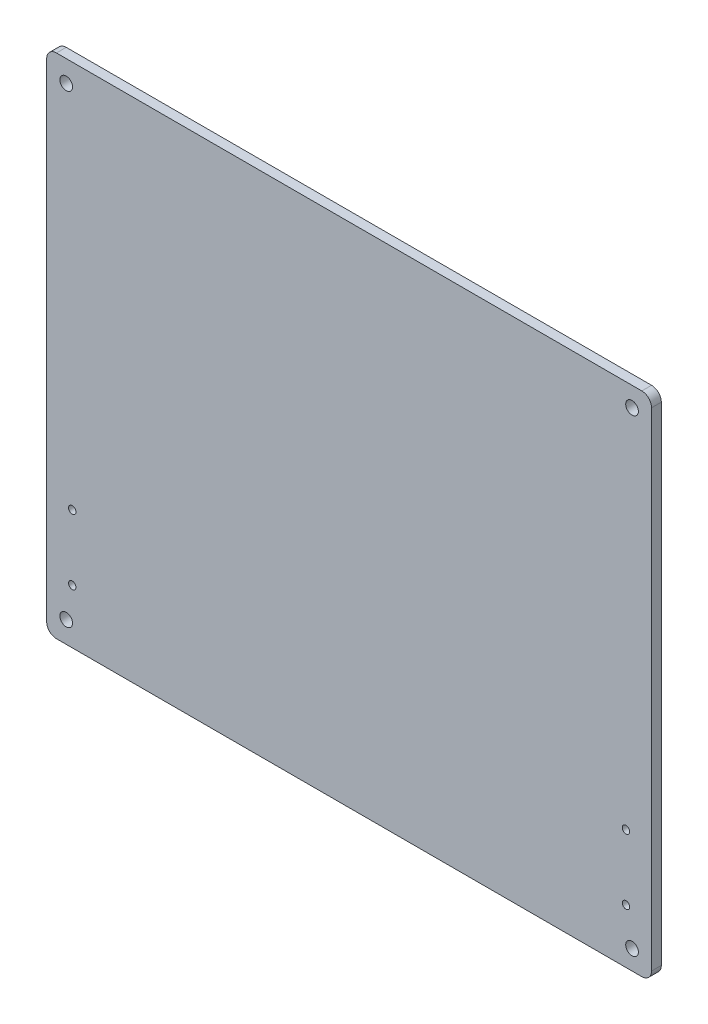
ISO-10303-21;
HEADER;
FILE_DESCRIPTION(('STEP AP214'),'2;1');
FILE_NAME('part.step','',(''),(''),'','','');
FILE_SCHEMA(('AUTOMOTIVE_DESIGN { 1 0 10303 214 1 1 1 1 }'));
ENDSEC;
DATA;
#1=APPLICATION_CONTEXT('core data for automotive mechanical design processes');
#2=APPLICATION_PROTOCOL_DEFINITION('international standard','automotive_design',2000,#1);
#3=PRODUCT_CONTEXT('',#1,'mechanical');
#4=PRODUCT('Part','Part','',(#3));
#5=PRODUCT_RELATED_PRODUCT_CATEGORY('part','',(#4));
#6=PRODUCT_DEFINITION_FORMATION('','',#4);
#7=PRODUCT_DEFINITION_CONTEXT('part definition',#1,'design');
#8=PRODUCT_DEFINITION('design','',#6,#7);
#9=PRODUCT_DEFINITION_SHAPE('','',#8);
#10=(LENGTH_UNIT() NAMED_UNIT(*) SI_UNIT(.MILLI.,.METRE.));
#11=(NAMED_UNIT(*) PLANE_ANGLE_UNIT() SI_UNIT($,.RADIAN.));
#12=(NAMED_UNIT(*) SI_UNIT($,.STERADIAN.) SOLID_ANGLE_UNIT());
#13=UNCERTAINTY_MEASURE_WITH_UNIT(LENGTH_MEASURE(1.E-05),#10,'distance_accuracy_value','');
#14=(GEOMETRIC_REPRESENTATION_CONTEXT(3) GLOBAL_UNCERTAINTY_ASSIGNED_CONTEXT((#13)) GLOBAL_UNIT_ASSIGNED_CONTEXT((#10,
#11,#12)) REPRESENTATION_CONTEXT('',''));
#15=CARTESIAN_POINT('',(0.,0.,0.));
#16=DIRECTION('',(0.,0.,1.));
#17=DIRECTION('',(1.,0.,0.));
#18=AXIS2_PLACEMENT_3D('',#15,#16,#17);
#19=CARTESIAN_POINT('',(-295.,-5.00000000000001,5.));
#20=DIRECTION('',(0.,0.,-1.));
#21=DIRECTION('',(-1.,0.,0.));
#22=AXIS2_PLACEMENT_3D('',#19,#20,#21);
#23=PLANE('',#22);
#24=CARTESIAN_POINT('',(-295.,-5.00000000000001,5.));
#25=DIRECTION('',(0.,0.,1.));
#26=DIRECTION('',(-1.,0.,0.));
#27=AXIS2_PLACEMENT_3D('',#24,#25,#26);
#28=CIRCLE('',#27,5.);
#29=CARTESIAN_POINT('',(-300.,-4.99999999999997,5.));
#30=VERTEX_POINT('',#29);
#31=CARTESIAN_POINT('',(-295.,-10.,5.));
#32=VERTEX_POINT('',#31);
#33=EDGE_CURVE('E149',#30,#32,#28,.T.);
#34=ORIENTED_EDGE('',*,*,#33,.T.);
#35=DIRECTION('',(1.,0.,0.));
#36=VECTOR('',#35,1.);
#37=CARTESIAN_POINT('',(-295.,-10.,5.));
#38=LINE('',#37,#36);
#39=CARTESIAN_POINT('',(4.99999999999997,-10.,5.));
#40=VERTEX_POINT('',#39);
#41=EDGE_CURVE('E97',#32,#40,#38,.T.);
#42=ORIENTED_EDGE('',*,*,#41,.T.);
#43=CARTESIAN_POINT('',(5.00000000000001,-5.00000000000001,5.));
#44=DIRECTION('',(0.,0.,1.));
#45=DIRECTION('',(1.,0.,0.));
#46=AXIS2_PLACEMENT_3D('',#43,#44,#45);
#47=CIRCLE('',#46,5.);
#48=CARTESIAN_POINT('',(10.,-5.00000000000001,5.));
#49=VERTEX_POINT('',#48);
#50=EDGE_CURVE('E164',#40,#49,#47,.T.);
#51=ORIENTED_EDGE('',*,*,#50,.T.);
#52=DIRECTION('',(0.,1.,0.));
#53=VECTOR('',#52,1.);
#54=CARTESIAN_POINT('',(10.,-4.99999999999997,5.));
#55=LINE('',#54,#53);
#56=CARTESIAN_POINT('',(10.,245.,5.));
#57=VERTEX_POINT('',#56);
#58=EDGE_CURVE('E177',#49,#57,#55,.T.);
#59=ORIENTED_EDGE('',*,*,#58,.T.);
#60=CARTESIAN_POINT('',(5.00000000000001,245.,5.));
#61=DIRECTION('',(0.,0.,1.));
#62=DIRECTION('',(-1.,0.,0.));
#63=AXIS2_PLACEMENT_3D('',#60,#61,#62);
#64=CIRCLE('',#63,5.);
#65=CARTESIAN_POINT('',(4.99999999999997,250.,5.));
#66=VERTEX_POINT('',#65);
#67=EDGE_CURVE('E116',#57,#66,#64,.T.);
#68=ORIENTED_EDGE('',*,*,#67,.T.);
#69=DIRECTION('',(-1.,0.,0.));
#70=VECTOR('',#69,1.);
#71=CARTESIAN_POINT('',(-295.,250.,5.));
#72=LINE('',#71,#70);
#73=CARTESIAN_POINT('',(-295.,250.,5.));
#74=VERTEX_POINT('',#73);
#75=EDGE_CURVE('E110',#66,#74,#72,.T.);
#76=ORIENTED_EDGE('',*,*,#75,.T.);
#77=CARTESIAN_POINT('',(-295.,245.,5.));
#78=DIRECTION('',(0.,0.,1.));
#79=DIRECTION('',(-1.,0.,0.));
#80=AXIS2_PLACEMENT_3D('',#77,#78,#79);
#81=CIRCLE('',#80,5.);
#82=CARTESIAN_POINT('',(-300.,245.,5.));
#83=VERTEX_POINT('',#82);
#84=EDGE_CURVE('E114',#74,#83,#81,.T.);
#85=ORIENTED_EDGE('',*,*,#84,.T.);
#86=DIRECTION('',(0.,-1.,0.));
#87=VECTOR('',#86,1.);
#88=CARTESIAN_POINT('',(-300.,-4.99999999999997,5.));
#89=LINE('',#88,#87);
#90=EDGE_CURVE('E54',#83,#30,#89,.T.);
#91=ORIENTED_EDGE('',*,*,#90,.T.);
#92=EDGE_LOOP('',(#34,#42,#51,#59,#68,#76,#85,#91));
#93=FACE_BOUND('',#92,.T.);
#94=CARTESIAN_POINT('',(0.,0.,5.));
#95=DIRECTION('',(0.,0.,1.));
#96=DIRECTION('',(1.,0.,0.));
#97=AXIS2_PLACEMENT_3D('',#94,#95,#96);
#98=CIRCLE('',#97,3.25);
#99=CARTESIAN_POINT('',(3.25,0.,5.));
#100=VERTEX_POINT('',#99);
#101=EDGE_CURVE('E138',#100,#100,#98,.T.);
#102=ORIENTED_EDGE('',*,*,#101,.F.);
#103=EDGE_LOOP('',(#102));
#104=FACE_BOUND('',#103,.T.);
#105=CARTESIAN_POINT('',(0.,240.,5.));
#106=DIRECTION('',(0.,0.,1.));
#107=DIRECTION('',(1.,0.,0.));
#108=AXIS2_PLACEMENT_3D('',#105,#106,#107);
#109=CIRCLE('',#108,3.25);
#110=CARTESIAN_POINT('',(3.25,240.,5.));
#111=VERTEX_POINT('',#110);
#112=EDGE_CURVE('E186',#111,#111,#109,.T.);
#113=ORIENTED_EDGE('',*,*,#112,.F.);
#114=EDGE_LOOP('',(#113));
#115=FACE_BOUND('',#114,.T.);
#116=CARTESIAN_POINT('',(-290.,239.,5.));
#117=DIRECTION('',(0.,0.,1.));
#118=DIRECTION('',(1.,0.,0.));
#119=AXIS2_PLACEMENT_3D('',#116,#117,#118);
#120=CIRCLE('',#119,3.24999999999995);
#121=CARTESIAN_POINT('',(-286.75,239.,5.));
#122=VERTEX_POINT('',#121);
#123=EDGE_CURVE('E192',#122,#122,#120,.T.);
#124=ORIENTED_EDGE('',*,*,#123,.F.);
#125=EDGE_LOOP('',(#124));
#126=FACE_BOUND('',#125,.T.);
#127=CARTESIAN_POINT('',(-290.,1.,5.));
#128=DIRECTION('',(0.,0.,1.));
#129=DIRECTION('',(1.,0.,0.));
#130=AXIS2_PLACEMENT_3D('',#127,#128,#129);
#131=CIRCLE('',#130,3.24999999999995);
#132=CARTESIAN_POINT('',(-286.75,1.,5.));
#133=VERTEX_POINT('',#132);
#134=EDGE_CURVE('E198',#133,#133,#131,.T.);
#135=ORIENTED_EDGE('',*,*,#134,.F.);
#136=EDGE_LOOP('',(#135));
#137=FACE_BOUND('',#136,.T.);
#138=CARTESIAN_POINT('',(-3.10000002888736,17.7826195094828,5.));
#139=DIRECTION('',(0.,0.,1.));
#140=DIRECTION('',(1.,0.,0.));
#141=AXIS2_PLACEMENT_3D('',#138,#139,#140);
#142=CIRCLE('',#141,1.9);
#143=CARTESIAN_POINT('',(-1.20000002888736,17.7826195094828,5.));
#144=VERTEX_POINT('',#143);
#145=EDGE_CURVE('E204',#144,#144,#142,.T.);
#146=ORIENTED_EDGE('',*,*,#145,.F.);
#147=EDGE_LOOP('',(#146));
#148=FACE_BOUND('',#147,.T.);
#149=CARTESIAN_POINT('',(-3.10000002888736,51.2173804905169,5.));
#150=DIRECTION('',(0.,0.,1.));
#151=DIRECTION('',(1.,0.,0.));
#152=AXIS2_PLACEMENT_3D('',#149,#150,#151);
#153=CIRCLE('',#152,1.9);
#154=CARTESIAN_POINT('',(-1.20000002888736,51.2173804905169,5.));
#155=VERTEX_POINT('',#154);
#156=EDGE_CURVE('E210',#155,#155,#153,.T.);
#157=ORIENTED_EDGE('',*,*,#156,.F.);
#158=EDGE_LOOP('',(#157));
#159=FACE_BOUND('',#158,.T.);
#160=CARTESIAN_POINT('',(-286.899999971113,51.2173804905169,5.));
#161=DIRECTION('',(0.,0.,1.));
#162=DIRECTION('',(-1.,0.,0.));
#163=AXIS2_PLACEMENT_3D('',#160,#161,#162);
#164=CIRCLE('',#163,1.90000000000005);
#165=CARTESIAN_POINT('',(-288.799999971113,51.2173804905169,5.));
#166=VERTEX_POINT('',#165);
#167=EDGE_CURVE('E216',#166,#166,#164,.T.);
#168=ORIENTED_EDGE('',*,*,#167,.F.);
#169=EDGE_LOOP('',(#168));
#170=FACE_BOUND('',#169,.T.);
#171=CARTESIAN_POINT('',(-286.899999971113,17.7826195094827,5.));
#172=DIRECTION('',(0.,0.,1.));
#173=DIRECTION('',(-1.,0.,0.));
#174=AXIS2_PLACEMENT_3D('',#171,#172,#173);
#175=CIRCLE('',#174,1.90000000000005);
#176=CARTESIAN_POINT('',(-288.799999971113,17.7826195094827,5.));
#177=VERTEX_POINT('',#176);
#178=EDGE_CURVE('E222',#177,#177,#175,.T.);
#179=ORIENTED_EDGE('',*,*,#178,.F.);
#180=EDGE_LOOP('',(#179));
#181=FACE_BOUND('',#180,.T.);
#182=ADVANCED_FACE('F37',(#93,#104,#115,#126,#137,#148,#159,#170,#181),#23,.F.);
#183=CARTESIAN_POINT('',(-295.,-5.00000000000001,0.));
#184=DIRECTION('',(0.,0.,-1.));
#185=DIRECTION('',(-1.,0.,0.));
#186=AXIS2_PLACEMENT_3D('',#183,#184,#185);
#187=PLANE('',#186);
#188=CARTESIAN_POINT('',(-286.899999971113,51.2173804905169,0.));
#189=DIRECTION('',(0.,0.,1.));
#190=DIRECTION('',(-1.,0.,0.));
#191=AXIS2_PLACEMENT_3D('',#188,#189,#190);
#192=CIRCLE('',#191,1.90000000000005);
#193=CARTESIAN_POINT('',(-288.799999971113,51.2173804905169,0.));
#194=VERTEX_POINT('',#193);
#195=EDGE_CURVE('E219',#194,#194,#192,.T.);
#196=ORIENTED_EDGE('',*,*,#195,.T.);
#197=EDGE_LOOP('',(#196));
#198=FACE_BOUND('',#197,.T.);
#199=CARTESIAN_POINT('',(-3.10000002888736,17.7826195094828,0.));
#200=DIRECTION('',(0.,0.,1.));
#201=DIRECTION('',(1.,0.,0.));
#202=AXIS2_PLACEMENT_3D('',#199,#200,#201);
#203=CIRCLE('',#202,1.9);
#204=CARTESIAN_POINT('',(-1.20000002888736,17.7826195094828,0.));
#205=VERTEX_POINT('',#204);
#206=EDGE_CURVE('E207',#205,#205,#203,.T.);
#207=ORIENTED_EDGE('',*,*,#206,.T.);
#208=EDGE_LOOP('',(#207));
#209=FACE_BOUND('',#208,.T.);
#210=CARTESIAN_POINT('',(-290.,239.,0.));
#211=DIRECTION('',(0.,0.,1.));
#212=DIRECTION('',(1.,0.,0.));
#213=AXIS2_PLACEMENT_3D('',#210,#211,#212);
#214=CIRCLE('',#213,3.24999999999995);
#215=CARTESIAN_POINT('',(-286.75,239.,0.));
#216=VERTEX_POINT('',#215);
#217=EDGE_CURVE('E195',#216,#216,#214,.T.);
#218=ORIENTED_EDGE('',*,*,#217,.T.);
#219=EDGE_LOOP('',(#218));
#220=FACE_BOUND('',#219,.T.);
#221=CARTESIAN_POINT('',(0.,0.,0.));
#222=DIRECTION('',(0.,0.,1.));
#223=DIRECTION('',(1.,0.,0.));
#224=AXIS2_PLACEMENT_3D('',#221,#222,#223);
#225=CIRCLE('',#224,3.25);
#226=CARTESIAN_POINT('',(3.25,0.,0.));
#227=VERTEX_POINT('',#226);
#228=EDGE_CURVE('E183',#227,#227,#225,.T.);
#229=ORIENTED_EDGE('',*,*,#228,.T.);
#230=EDGE_LOOP('',(#229));
#231=FACE_BOUND('',#230,.T.);
#232=CARTESIAN_POINT('',(-295.,-5.00000000000001,0.));
#233=DIRECTION('',(0.,0.,1.));
#234=DIRECTION('',(-1.,0.,0.));
#235=AXIS2_PLACEMENT_3D('',#232,#233,#234);
#236=CIRCLE('',#235,5.);
#237=CARTESIAN_POINT('',(-300.,-4.99999999999997,0.));
#238=VERTEX_POINT('',#237);
#239=CARTESIAN_POINT('',(-295.,-10.,0.));
#240=VERTEX_POINT('',#239);
#241=EDGE_CURVE('E134',#238,#240,#236,.T.);
#242=ORIENTED_EDGE('',*,*,#241,.F.);
#243=DIRECTION('',(0.,-1.,0.));
#244=VECTOR('',#243,1.);
#245=CARTESIAN_POINT('',(-300.,-4.99999999999997,0.));
#246=LINE('',#245,#244);
#247=CARTESIAN_POINT('',(-300.,245.,0.));
#248=VERTEX_POINT('',#247);
#249=EDGE_CURVE('E89',#248,#238,#246,.T.);
#250=ORIENTED_EDGE('',*,*,#249,.F.);
#251=CARTESIAN_POINT('',(-295.,245.,0.));
#252=DIRECTION('',(0.,0.,1.));
#253=DIRECTION('',(-1.,0.,0.));
#254=AXIS2_PLACEMENT_3D('',#251,#252,#253);
#255=CIRCLE('',#254,5.);
#256=CARTESIAN_POINT('',(-295.,250.,0.));
#257=VERTEX_POINT('',#256);
#258=EDGE_CURVE('E83',#257,#248,#255,.T.);
#259=ORIENTED_EDGE('',*,*,#258,.F.);
#260=DIRECTION('',(-1.,0.,0.));
#261=VECTOR('',#260,1.);
#262=CARTESIAN_POINT('',(-295.,250.,0.));
#263=LINE('',#262,#261);
#264=CARTESIAN_POINT('',(4.99999999999997,250.,0.));
#265=VERTEX_POINT('',#264);
#266=EDGE_CURVE('E124',#265,#257,#263,.T.);
#267=ORIENTED_EDGE('',*,*,#266,.F.);
#268=CARTESIAN_POINT('',(5.00000000000001,245.,0.));
#269=DIRECTION('',(0.,0.,1.));
#270=DIRECTION('',(-1.,0.,0.));
#271=AXIS2_PLACEMENT_3D('',#268,#269,#270);
#272=CIRCLE('',#271,5.);
#273=CARTESIAN_POINT('',(10.,245.,0.));
#274=VERTEX_POINT('',#273);
#275=EDGE_CURVE('E144',#274,#265,#272,.T.);
#276=ORIENTED_EDGE('',*,*,#275,.F.);
#277=DIRECTION('',(0.,1.,0.));
#278=VECTOR('',#277,1.);
#279=CARTESIAN_POINT('',(10.,-4.99999999999997,0.));
#280=LINE('',#279,#278);
#281=CARTESIAN_POINT('',(10.,-5.00000000000001,0.));
#282=VERTEX_POINT('',#281);
#283=EDGE_CURVE('E142',#282,#274,#280,.T.);
#284=ORIENTED_EDGE('',*,*,#283,.F.);
#285=CARTESIAN_POINT('',(5.00000000000001,-5.00000000000001,0.));
#286=DIRECTION('',(0.,0.,1.));
#287=DIRECTION('',(1.,0.,0.));
#288=AXIS2_PLACEMENT_3D('',#285,#286,#287);
#289=CIRCLE('',#288,5.);
#290=CARTESIAN_POINT('',(4.99999999999997,-10.,0.));
#291=VERTEX_POINT('',#290);
#292=EDGE_CURVE('E140',#291,#282,#289,.T.);
#293=ORIENTED_EDGE('',*,*,#292,.F.);
#294=DIRECTION('',(1.,0.,0.));
#295=VECTOR('',#294,1.);
#296=CARTESIAN_POINT('',(-295.,-10.,0.));
#297=LINE('',#296,#295);
#298=EDGE_CURVE('E137',#240,#291,#297,.T.);
#299=ORIENTED_EDGE('',*,*,#298,.F.);
#300=EDGE_LOOP('',(#242,#250,#259,#267,#276,#284,#293,#299));
#301=FACE_BOUND('',#300,.T.);
#302=CARTESIAN_POINT('',(0.,240.,0.));
#303=DIRECTION('',(0.,0.,1.));
#304=DIRECTION('',(1.,0.,0.));
#305=AXIS2_PLACEMENT_3D('',#302,#303,#304);
#306=CIRCLE('',#305,3.25);
#307=CARTESIAN_POINT('',(3.25,240.,0.));
#308=VERTEX_POINT('',#307);
#309=EDGE_CURVE('E189',#308,#308,#306,.T.);
#310=ORIENTED_EDGE('',*,*,#309,.T.);
#311=EDGE_LOOP('',(#310));
#312=FACE_BOUND('',#311,.T.);
#313=CARTESIAN_POINT('',(-290.,1.,0.));
#314=DIRECTION('',(0.,0.,1.));
#315=DIRECTION('',(1.,0.,0.));
#316=AXIS2_PLACEMENT_3D('',#313,#314,#315);
#317=CIRCLE('',#316,3.24999999999995);
#318=CARTESIAN_POINT('',(-286.75,1.,0.));
#319=VERTEX_POINT('',#318);
#320=EDGE_CURVE('E201',#319,#319,#317,.T.);
#321=ORIENTED_EDGE('',*,*,#320,.T.);
#322=EDGE_LOOP('',(#321));
#323=FACE_BOUND('',#322,.T.);
#324=CARTESIAN_POINT('',(-3.10000002888736,51.2173804905169,0.));
#325=DIRECTION('',(0.,0.,1.));
#326=DIRECTION('',(1.,0.,0.));
#327=AXIS2_PLACEMENT_3D('',#324,#325,#326);
#328=CIRCLE('',#327,1.9);
#329=CARTESIAN_POINT('',(-1.20000002888736,51.2173804905169,0.));
#330=VERTEX_POINT('',#329);
#331=EDGE_CURVE('E213',#330,#330,#328,.T.);
#332=ORIENTED_EDGE('',*,*,#331,.T.);
#333=EDGE_LOOP('',(#332));
#334=FACE_BOUND('',#333,.T.);
#335=CARTESIAN_POINT('',(-286.899999971113,17.7826195094827,0.));
#336=DIRECTION('',(0.,0.,1.));
#337=DIRECTION('',(-1.,0.,0.));
#338=AXIS2_PLACEMENT_3D('',#335,#336,#337);
#339=CIRCLE('',#338,1.90000000000005);
#340=CARTESIAN_POINT('',(-288.799999971113,17.7826195094827,0.));
#341=VERTEX_POINT('',#340);
#342=EDGE_CURVE('E225',#341,#341,#339,.T.);
#343=ORIENTED_EDGE('',*,*,#342,.T.);
#344=EDGE_LOOP('',(#343));
#345=FACE_BOUND('',#344,.T.);
#346=ADVANCED_FACE('F168',(#198,#209,#220,#231,#301,#312,#323,#334,#345),#187,.T.);
#347=CARTESIAN_POINT('',(-295.,-5.00000000000001,5.));
#348=DIRECTION('',(0.,0.,-1.));
#349=DIRECTION('',(-1.,0.,0.));
#350=AXIS2_PLACEMENT_3D('',#347,#348,#349);
#351=CYLINDRICAL_SURFACE('',#350,5.);
#352=ORIENTED_EDGE('',*,*,#241,.T.);
#353=DIRECTION('',(0.,0.,-1.));
#354=VECTOR('',#353,1.);
#355=CARTESIAN_POINT('',(-295.,-10.,5.));
#356=LINE('',#355,#354);
#357=EDGE_CURVE('E11',#32,#240,#356,.T.);
#358=ORIENTED_EDGE('',*,*,#357,.F.);
#359=ORIENTED_EDGE('',*,*,#33,.F.);
#360=DIRECTION('',(0.,0.,-1.));
#361=VECTOR('',#360,1.);
#362=CARTESIAN_POINT('',(-300.,-4.99999999999997,5.));
#363=LINE('',#362,#361);
#364=EDGE_CURVE('E130',#30,#238,#363,.T.);
#365=ORIENTED_EDGE('',*,*,#364,.T.);
#366=EDGE_LOOP('',(#352,#358,#359,#365));
#367=FACE_BOUND('',#366,.T.);
#368=ADVANCED_FACE('F39',(#367),#351,.T.);
#369=CARTESIAN_POINT('',(-295.,-10.,5.));
#370=DIRECTION('',(0.,1.,0.));
#371=DIRECTION('',(0.,0.,1.));
#372=AXIS2_PLACEMENT_3D('',#369,#370,#371);
#373=PLANE('',#372);
#374=ORIENTED_EDGE('',*,*,#298,.T.);
#375=DIRECTION('',(0.,0.,-1.));
#376=VECTOR('',#375,1.);
#377=CARTESIAN_POINT('',(4.99999999999997,-10.,5.));
#378=LINE('',#377,#376);
#379=EDGE_CURVE('E46',#40,#291,#378,.T.);
#380=ORIENTED_EDGE('',*,*,#379,.F.);
#381=ORIENTED_EDGE('',*,*,#41,.F.);
#382=ORIENTED_EDGE('',*,*,#357,.T.);
#383=EDGE_LOOP('',(#374,#380,#381,#382));
#384=FACE_BOUND('',#383,.T.);
#385=ADVANCED_FACE('F257',(#384),#373,.F.);
#386=CARTESIAN_POINT('',(5.00000000000001,-5.00000000000001,5.));
#387=DIRECTION('',(0.,0.,-1.));
#388=DIRECTION('',(-1.,0.,0.));
#389=AXIS2_PLACEMENT_3D('',#386,#387,#388);
#390=CYLINDRICAL_SURFACE('',#389,5.);
#391=ORIENTED_EDGE('',*,*,#292,.T.);
#392=DIRECTION('',(0.,0.,-1.));
#393=VECTOR('',#392,1.);
#394=CARTESIAN_POINT('',(10.,-5.00000000000001,5.));
#395=LINE('',#394,#393);
#396=EDGE_CURVE('E156',#49,#282,#395,.T.);
#397=ORIENTED_EDGE('',*,*,#396,.F.);
#398=ORIENTED_EDGE('',*,*,#50,.F.);
#399=ORIENTED_EDGE('',*,*,#379,.T.);
#400=EDGE_LOOP('',(#391,#397,#398,#399));
#401=FACE_BOUND('',#400,.T.);
#402=ADVANCED_FACE('F162',(#401),#390,.T.);
#403=CARTESIAN_POINT('',(10.,-4.99999999999997,5.));
#404=DIRECTION('',(-1.,0.,0.));
#405=DIRECTION('',(0.,0.,1.));
#406=AXIS2_PLACEMENT_3D('',#403,#404,#405);
#407=PLANE('',#406);
#408=ORIENTED_EDGE('',*,*,#283,.T.);
#409=DIRECTION('',(0.,0.,-1.));
#410=VECTOR('',#409,1.);
#411=CARTESIAN_POINT('',(10.,245.,5.));
#412=LINE('',#411,#410);
#413=EDGE_CURVE('E153',#57,#274,#412,.T.);
#414=ORIENTED_EDGE('',*,*,#413,.F.);
#415=ORIENTED_EDGE('',*,*,#58,.F.);
#416=ORIENTED_EDGE('',*,*,#396,.T.);
#417=EDGE_LOOP('',(#408,#414,#415,#416));
#418=FACE_BOUND('',#417,.T.);
#419=ADVANCED_FACE('F173',(#418),#407,.F.);
#420=CARTESIAN_POINT('',(5.00000000000001,245.,5.));
#421=DIRECTION('',(0.,0.,-1.));
#422=DIRECTION('',(-1.,0.,0.));
#423=AXIS2_PLACEMENT_3D('',#420,#421,#422);
#424=CYLINDRICAL_SURFACE('',#423,5.);
#425=ORIENTED_EDGE('',*,*,#275,.T.);
#426=DIRECTION('',(0.,0.,-1.));
#427=VECTOR('',#426,1.);
#428=CARTESIAN_POINT('',(4.99999999999997,250.,5.));
#429=LINE('',#428,#427);
#430=EDGE_CURVE('E125',#66,#265,#429,.T.);
#431=ORIENTED_EDGE('',*,*,#430,.F.);
#432=ORIENTED_EDGE('',*,*,#67,.F.);
#433=ORIENTED_EDGE('',*,*,#413,.T.);
#434=EDGE_LOOP('',(#425,#431,#432,#433));
#435=FACE_BOUND('',#434,.T.);
#436=ADVANCED_FACE('F176',(#435),#424,.T.);
#437=CARTESIAN_POINT('',(-295.,250.,5.));
#438=DIRECTION('',(0.,-1.,0.));
#439=DIRECTION('',(0.,0.,-1.));
#440=AXIS2_PLACEMENT_3D('',#437,#438,#439);
#441=PLANE('',#440);
#442=ORIENTED_EDGE('',*,*,#266,.T.);
#443=DIRECTION('',(0.,0.,-1.));
#444=VECTOR('',#443,1.);
#445=CARTESIAN_POINT('',(-295.,250.,5.));
#446=LINE('',#445,#444);
#447=EDGE_CURVE('E121',#74,#257,#446,.T.);
#448=ORIENTED_EDGE('',*,*,#447,.F.);
#449=ORIENTED_EDGE('',*,*,#75,.F.);
#450=ORIENTED_EDGE('',*,*,#430,.T.);
#451=EDGE_LOOP('',(#442,#448,#449,#450));
#452=FACE_BOUND('',#451,.T.);
#453=ADVANCED_FACE('F122',(#452),#441,.F.);
#454=CARTESIAN_POINT('',(-295.,245.,5.));
#455=DIRECTION('',(0.,0.,-1.));
#456=DIRECTION('',(-1.,0.,0.));
#457=AXIS2_PLACEMENT_3D('',#454,#455,#456);
#458=CYLINDRICAL_SURFACE('',#457,5.);
#459=ORIENTED_EDGE('',*,*,#258,.T.);
#460=DIRECTION('',(0.,0.,-1.));
#461=VECTOR('',#460,1.);
#462=CARTESIAN_POINT('',(-300.,245.,5.));
#463=LINE('',#462,#461);
#464=EDGE_CURVE('E126',#83,#248,#463,.T.);
#465=ORIENTED_EDGE('',*,*,#464,.F.);
#466=ORIENTED_EDGE('',*,*,#84,.F.);
#467=ORIENTED_EDGE('',*,*,#447,.T.);
#468=EDGE_LOOP('',(#459,#465,#466,#467));
#469=FACE_BOUND('',#468,.T.);
#470=ADVANCED_FACE('F128',(#469),#458,.T.);
#471=CARTESIAN_POINT('',(-300.,-4.99999999999997,5.));
#472=DIRECTION('',(1.,0.,0.));
#473=DIRECTION('',(0.,0.,-1.));
#474=AXIS2_PLACEMENT_3D('',#471,#472,#473);
#475=PLANE('',#474);
#476=ORIENTED_EDGE('',*,*,#249,.T.);
#477=ORIENTED_EDGE('',*,*,#364,.F.);
#478=ORIENTED_EDGE('',*,*,#90,.F.);
#479=ORIENTED_EDGE('',*,*,#464,.T.);
#480=EDGE_LOOP('',(#476,#477,#478,#479));
#481=FACE_BOUND('',#480,.T.);
#482=ADVANCED_FACE('F245',(#481),#475,.F.);
#483=CARTESIAN_POINT('',(0.,0.,5.));
#484=DIRECTION('',(0.,0.,-1.));
#485=DIRECTION('',(-1.,0.,0.));
#486=AXIS2_PLACEMENT_3D('',#483,#484,#485);
#487=CYLINDRICAL_SURFACE('',#486,3.25);
#488=ORIENTED_EDGE('',*,*,#101,.T.);
#489=EDGE_LOOP('',(#488));
#490=FACE_BOUND('',#489,.T.);
#491=ORIENTED_EDGE('',*,*,#228,.F.);
#492=EDGE_LOOP('',(#491));
#493=FACE_BOUND('',#492,.T.);
#494=ADVANCED_FACE('F242',(#490,#493),#487,.F.);
#495=CARTESIAN_POINT('',(0.,240.,5.));
#496=DIRECTION('',(0.,0.,-1.));
#497=DIRECTION('',(-1.,0.,0.));
#498=AXIS2_PLACEMENT_3D('',#495,#496,#497);
#499=CYLINDRICAL_SURFACE('',#498,3.25);
#500=ORIENTED_EDGE('',*,*,#112,.T.);
#501=EDGE_LOOP('',(#500));
#502=FACE_BOUND('',#501,.T.);
#503=ORIENTED_EDGE('',*,*,#309,.F.);
#504=EDGE_LOOP('',(#503));
#505=FACE_BOUND('',#504,.T.);
#506=ADVANCED_FACE('F333',(#502,#505),#499,.F.);
#507=CARTESIAN_POINT('',(-290.,239.,5.));
#508=DIRECTION('',(0.,0.,-1.));
#509=DIRECTION('',(-1.,0.,0.));
#510=AXIS2_PLACEMENT_3D('',#507,#508,#509);
#511=CYLINDRICAL_SURFACE('',#510,3.24999999999995);
#512=ORIENTED_EDGE('',*,*,#123,.T.);
#513=EDGE_LOOP('',(#512));
#514=FACE_BOUND('',#513,.T.);
#515=ORIENTED_EDGE('',*,*,#217,.F.);
#516=EDGE_LOOP('',(#515));
#517=FACE_BOUND('',#516,.T.);
#518=ADVANCED_FACE('F342',(#514,#517),#511,.F.);
#519=CARTESIAN_POINT('',(-290.,1.,5.));
#520=DIRECTION('',(0.,0.,-1.));
#521=DIRECTION('',(-1.,0.,0.));
#522=AXIS2_PLACEMENT_3D('',#519,#520,#521);
#523=CYLINDRICAL_SURFACE('',#522,3.24999999999995);
#524=ORIENTED_EDGE('',*,*,#134,.T.);
#525=EDGE_LOOP('',(#524));
#526=FACE_BOUND('',#525,.T.);
#527=ORIENTED_EDGE('',*,*,#320,.F.);
#528=EDGE_LOOP('',(#527));
#529=FACE_BOUND('',#528,.T.);
#530=ADVANCED_FACE('F351',(#526,#529),#523,.F.);
#531=CARTESIAN_POINT('',(-3.10000002888736,17.7826195094828,5.));
#532=DIRECTION('',(0.,0.,-1.));
#533=DIRECTION('',(-1.,0.,0.));
#534=AXIS2_PLACEMENT_3D('',#531,#532,#533);
#535=CYLINDRICAL_SURFACE('',#534,1.9);
#536=ORIENTED_EDGE('',*,*,#145,.T.);
#537=EDGE_LOOP('',(#536));
#538=FACE_BOUND('',#537,.T.);
#539=ORIENTED_EDGE('',*,*,#206,.F.);
#540=EDGE_LOOP('',(#539));
#541=FACE_BOUND('',#540,.T.);
#542=ADVANCED_FACE('F361',(#538,#541),#535,.F.);
#543=CARTESIAN_POINT('',(-3.10000002888736,51.2173804905169,5.));
#544=DIRECTION('',(0.,0.,-1.));
#545=DIRECTION('',(-1.,0.,0.));
#546=AXIS2_PLACEMENT_3D('',#543,#544,#545);
#547=CYLINDRICAL_SURFACE('',#546,1.9);
#548=ORIENTED_EDGE('',*,*,#156,.T.);
#549=EDGE_LOOP('',(#548));
#550=FACE_BOUND('',#549,.T.);
#551=ORIENTED_EDGE('',*,*,#331,.F.);
#552=EDGE_LOOP('',(#551));
#553=FACE_BOUND('',#552,.T.);
#554=ADVANCED_FACE('F371',(#550,#553),#547,.F.);
#555=CARTESIAN_POINT('',(-286.899999971113,51.2173804905169,5.));
#556=DIRECTION('',(0.,0.,-1.));
#557=DIRECTION('',(-1.,0.,0.));
#558=AXIS2_PLACEMENT_3D('',#555,#556,#557);
#559=CYLINDRICAL_SURFACE('',#558,1.90000000000005);
#560=ORIENTED_EDGE('',*,*,#167,.T.);
#561=EDGE_LOOP('',(#560));
#562=FACE_BOUND('',#561,.T.);
#563=ORIENTED_EDGE('',*,*,#195,.F.);
#564=EDGE_LOOP('',(#563));
#565=FACE_BOUND('',#564,.T.);
#566=ADVANCED_FACE('F381',(#562,#565),#559,.F.);
#567=CARTESIAN_POINT('',(-286.899999971113,17.7826195094827,5.));
#568=DIRECTION('',(0.,0.,-1.));
#569=DIRECTION('',(-1.,0.,0.));
#570=AXIS2_PLACEMENT_3D('',#567,#568,#569);
#571=CYLINDRICAL_SURFACE('',#570,1.90000000000005);
#572=ORIENTED_EDGE('',*,*,#178,.T.);
#573=EDGE_LOOP('',(#572));
#574=FACE_BOUND('',#573,.T.);
#575=ORIENTED_EDGE('',*,*,#342,.F.);
#576=EDGE_LOOP('',(#575));
#577=FACE_BOUND('',#576,.T.);
#578=ADVANCED_FACE('F231',(#574,#577),#571,.F.);
#579=CLOSED_SHELL('',(#182,#346,#368,#385,#402,#419,#436,#453,#470,#482,#494,#506,#518,#530,
#542,#554,#566,#578));
#580=MANIFOLD_SOLID_BREP('B2',#579);
#581=ADVANCED_BREP_SHAPE_REPRESENTATION('',(#18,#580),#14);
#582=SHAPE_DEFINITION_REPRESENTATION(#9,#581);
ENDSEC;
END-ISO-10303-21;
